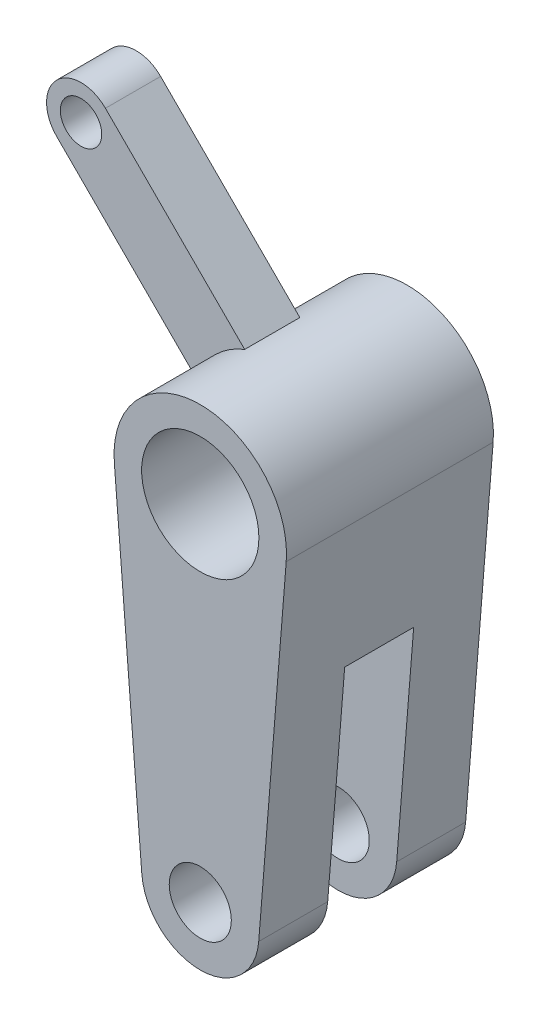
ISO-10303-21;
HEADER;
FILE_DESCRIPTION(('STEP AP214'),'2;1');
FILE_NAME('part.step','',(''),(''),'','','');
FILE_SCHEMA(('AUTOMOTIVE_DESIGN { 1 0 10303 214 1 1 1 1 }'));
ENDSEC;
DATA;
#1=APPLICATION_CONTEXT('core data for automotive mechanical design processes');
#2=APPLICATION_PROTOCOL_DEFINITION('international standard','automotive_design',2000,#1);
#3=PRODUCT_CONTEXT('',#1,'mechanical');
#4=PRODUCT('Part','Part','',(#3));
#5=PRODUCT_RELATED_PRODUCT_CATEGORY('part','',(#4));
#6=PRODUCT_DEFINITION_FORMATION('','',#4);
#7=PRODUCT_DEFINITION_CONTEXT('part definition',#1,'design');
#8=PRODUCT_DEFINITION('design','',#6,#7);
#9=PRODUCT_DEFINITION_SHAPE('','',#8);
#10=(LENGTH_UNIT() NAMED_UNIT(*) SI_UNIT(.MILLI.,.METRE.));
#11=(NAMED_UNIT(*) PLANE_ANGLE_UNIT() SI_UNIT($,.RADIAN.));
#12=(NAMED_UNIT(*) SI_UNIT($,.STERADIAN.) SOLID_ANGLE_UNIT());
#13=UNCERTAINTY_MEASURE_WITH_UNIT(LENGTH_MEASURE(1.E-05),#10,'distance_accuracy_value','');
#14=(GEOMETRIC_REPRESENTATION_CONTEXT(3) GLOBAL_UNCERTAINTY_ASSIGNED_CONTEXT((#13)) GLOBAL_UNIT_ASSIGNED_CONTEXT((#10,
#11,#12)) REPRESENTATION_CONTEXT('',''));
#15=CARTESIAN_POINT('',(0.,0.,0.));
#16=DIRECTION('',(0.,0.,1.));
#17=DIRECTION('',(1.,0.,0.));
#18=AXIS2_PLACEMENT_3D('',#15,#16,#17);
#19=CARTESIAN_POINT('',(0.,-50.,15.));
#20=DIRECTION('',(0.,0.,-1.));
#21=DIRECTION('',(-1.,0.,0.));
#22=AXIS2_PLACEMENT_3D('',#19,#20,#21);
#23=CYLINDRICAL_SURFACE('',#22,4.5);
#24=CARTESIAN_POINT('',(0.,-50.,15.));
#25=DIRECTION('',(0.,0.,1.));
#26=DIRECTION('',(1.,0.,0.));
#27=AXIS2_PLACEMENT_3D('',#24,#25,#26);
#28=CIRCLE('',#27,4.5);
#29=CARTESIAN_POINT('',(4.50000000000001,-50.,15.));
#30=VERTEX_POINT('',#29);
#31=EDGE_CURVE('E204',#30,#30,#28,.T.);
#32=ORIENTED_EDGE('',*,*,#31,.T.);
#33=EDGE_LOOP('',(#32));
#34=FACE_BOUND('',#33,.T.);
#35=CARTESIAN_POINT('',(0.,-50.,5.));
#36=DIRECTION('',(0.,0.,-1.));
#37=DIRECTION('',(-1.,0.,0.));
#38=AXIS2_PLACEMENT_3D('',#35,#36,#37);
#39=CIRCLE('',#38,4.5);
#40=CARTESIAN_POINT('',(-4.5,-50.,5.));
#41=VERTEX_POINT('',#40);
#42=EDGE_CURVE('E180',#41,#41,#39,.T.);
#43=ORIENTED_EDGE('',*,*,#42,.T.);
#44=EDGE_LOOP('',(#43));
#45=FACE_BOUND('',#44,.T.);
#46=ADVANCED_FACE('F37',(#34,#45),#23,.F.);
#47=CARTESIAN_POINT('',(0.,-50.,15.));
#48=DIRECTION('',(0.,0.,-1.));
#49=DIRECTION('',(-1.,0.,0.));
#50=AXIS2_PLACEMENT_3D('',#47,#48,#49);
#51=CYLINDRICAL_SURFACE('',#50,8.5);
#52=CARTESIAN_POINT('',(0.,-50.,5.));
#53=DIRECTION('',(0.,0.,-1.));
#54=DIRECTION('',(-1.,0.,0.));
#55=AXIS2_PLACEMENT_3D('',#52,#53,#54);
#56=CIRCLE('',#55,8.5);
#57=CARTESIAN_POINT('',(8.47275634017644,-50.68,5.));
#58=VERTEX_POINT('',#57);
#59=CARTESIAN_POINT('',(-8.47275634017643,-50.68,5.));
#60=VERTEX_POINT('',#59);
#61=EDGE_CURVE('E238',#58,#60,#56,.T.);
#62=ORIENTED_EDGE('',*,*,#61,.F.);
#63=DIRECTION('',(0.,0.,-1.));
#64=VECTOR('',#63,1.);
#65=CARTESIAN_POINT('',(8.47275634017644,-50.68,15.));
#66=LINE('',#65,#64);
#67=CARTESIAN_POINT('',(8.47275634017644,-50.68,15.));
#68=VERTEX_POINT('',#67);
#69=EDGE_CURVE('E226',#68,#58,#66,.T.);
#70=ORIENTED_EDGE('',*,*,#69,.F.);
#71=CARTESIAN_POINT('',(0.,-50.,15.));
#72=DIRECTION('',(0.,0.,1.));
#73=DIRECTION('',(1.,0.,0.));
#74=AXIS2_PLACEMENT_3D('',#71,#72,#73);
#75=CIRCLE('',#74,8.5);
#76=CARTESIAN_POINT('',(-8.47275634017643,-50.68,15.));
#77=VERTEX_POINT('',#76);
#78=EDGE_CURVE('E202',#77,#68,#75,.T.);
#79=ORIENTED_EDGE('',*,*,#78,.F.);
#80=DIRECTION('',(0.,0.,-1.));
#81=VECTOR('',#80,1.);
#82=CARTESIAN_POINT('',(-8.47275634017643,-50.68,15.));
#83=LINE('',#82,#81);
#84=EDGE_CURVE('E230',#77,#60,#83,.T.);
#85=ORIENTED_EDGE('',*,*,#84,.T.);
#86=EDGE_LOOP('',(#62,#70,#79,#85));
#87=FACE_BOUND('',#86,.T.);
#88=ADVANCED_FACE('F271',(#87),#51,.T.);
#89=CARTESIAN_POINT('',(12.4599357943771,-0.999999999999998,15.));
#90=DIRECTION('',(0.996794863550169,-0.0799999999999999,0.));
#91=DIRECTION('',(0.0799999999999999,0.996794863550169,0.));
#92=AXIS2_PLACEMENT_3D('',#89,#90,#91);
#93=PLANE('',#92);
#94=DIRECTION('',(0.0799999999999999,0.996794863550169,0.));
#95=VECTOR('',#94,1.);
#96=CARTESIAN_POINT('',(12.4599357943771,-0.999999999999998,-5.));
#97=LINE('',#96,#95);
#98=CARTESIAN_POINT('',(8.47275634017644,-50.68,-5.));
#99=VERTEX_POINT('',#98);
#100=CARTESIAN_POINT('',(10.9350483219574,-20.,-5.));
#101=VERTEX_POINT('',#100);
#102=EDGE_CURVE('E186',#99,#101,#97,.T.);
#103=ORIENTED_EDGE('',*,*,#102,.F.);
#104=CARTESIAN_POINT('',(8.47275634017644,-50.68,-15.));
#105=VERTEX_POINT('',#104);
#106=EDGE_CURVE('E210',#99,#105,#66,.T.);
#107=ORIENTED_EDGE('',*,*,#106,.T.);
#108=DIRECTION('',(-0.0799999999999999,-0.996794863550169,0.));
#109=VECTOR('',#108,1.);
#110=CARTESIAN_POINT('',(12.4599357943771,-0.999999999999998,-15.));
#111=LINE('',#110,#109);
#112=CARTESIAN_POINT('',(12.4599357943771,-1.,-15.));
#113=VERTEX_POINT('',#112);
#114=EDGE_CURVE('E193',#113,#105,#111,.T.);
#115=ORIENTED_EDGE('',*,*,#114,.F.);
#116=DIRECTION('',(0.,0.,-1.));
#117=VECTOR('',#116,1.);
#118=CARTESIAN_POINT('',(12.4599357943771,-1.,15.));
#119=LINE('',#118,#117);
#120=CARTESIAN_POINT('',(12.4599357943771,-1.,15.));
#121=VERTEX_POINT('',#120);
#122=EDGE_CURVE('E236',#121,#113,#119,.T.);
#123=ORIENTED_EDGE('',*,*,#122,.F.);
#124=DIRECTION('',(-0.0799999999999999,-0.996794863550169,0.));
#125=VECTOR('',#124,1.);
#126=CARTESIAN_POINT('',(12.4599357943771,-0.999999999999998,15.));
#127=LINE('',#126,#125);
#128=EDGE_CURVE('E194',#121,#68,#127,.T.);
#129=ORIENTED_EDGE('',*,*,#128,.T.);
#130=ORIENTED_EDGE('',*,*,#69,.T.);
#131=DIRECTION('',(0.0799999999999999,0.996794863550169,0.));
#132=VECTOR('',#131,1.);
#133=CARTESIAN_POINT('',(12.4599357943771,-0.999999999999998,5.));
#134=LINE('',#133,#132);
#135=CARTESIAN_POINT('',(10.9350483219574,-20.,5.));
#136=VERTEX_POINT('',#135);
#137=EDGE_CURVE('E177',#58,#136,#134,.T.);
#138=ORIENTED_EDGE('',*,*,#137,.T.);
#139=DIRECTION('',(0.,0.,1.));
#140=VECTOR('',#139,1.);
#141=CARTESIAN_POINT('',(10.9350483219574,-20.,15.));
#142=LINE('',#141,#140);
#143=EDGE_CURVE('E191',#101,#136,#142,.T.);
#144=ORIENTED_EDGE('',*,*,#143,.F.);
#145=EDGE_LOOP('',(#103,#107,#115,#123,#129,#130,#138,#144));
#146=FACE_BOUND('',#145,.T.);
#147=ADVANCED_FACE('F39',(#146),#93,.T.);
#148=CARTESIAN_POINT('',(0.,0.,15.));
#149=DIRECTION('',(0.,0.,-1.));
#150=DIRECTION('',(-1.,0.,0.));
#151=AXIS2_PLACEMENT_3D('',#148,#149,#150);
#152=CYLINDRICAL_SURFACE('',#151,12.5);
#153=DIRECTION('',(0.,0.,-1.));
#154=VECTOR('',#153,1.);
#155=CARTESIAN_POINT('',(-4.56539196707712,11.6364597789426,4.));
#156=LINE('',#155,#154);
#157=CARTESIAN_POINT('',(-4.56539196707712,11.6364597789426,4.));
#158=VERTEX_POINT('',#157);
#159=CARTESIAN_POINT('',(-4.56539196707712,11.6364597789426,-4.));
#160=VERTEX_POINT('',#159);
#161=EDGE_CURVE('E52',#158,#160,#156,.T.);
#162=ORIENTED_EDGE('',*,*,#161,.F.);
#163=CARTESIAN_POINT('',(0.,0.,4.));
#164=DIRECTION('',(0.,0.,1.));
#165=DIRECTION('',(1.,0.,0.));
#166=AXIS2_PLACEMENT_3D('',#163,#164,#165);
#167=CIRCLE('',#166,12.5);
#168=CARTESIAN_POINT('',(-11.6364597789426,4.56539196707706,4.));
#169=VERTEX_POINT('',#168);
#170=EDGE_CURVE('E57',#158,#169,#167,.T.);
#171=ORIENTED_EDGE('',*,*,#170,.T.);
#172=DIRECTION('',(0.,0.,-1.));
#173=VECTOR('',#172,1.);
#174=CARTESIAN_POINT('',(-11.6364597789426,4.56539196707707,4.));
#175=LINE('',#174,#173);
#176=CARTESIAN_POINT('',(-11.6364597789426,4.56539196707707,-4.));
#177=VERTEX_POINT('',#176);
#178=EDGE_CURVE('E153',#169,#177,#175,.T.);
#179=ORIENTED_EDGE('',*,*,#178,.T.);
#180=CARTESIAN_POINT('',(0.,0.,-4.));
#181=DIRECTION('',(0.,0.,1.));
#182=DIRECTION('',(1.,0.,0.));
#183=AXIS2_PLACEMENT_3D('',#180,#181,#182);
#184=CIRCLE('',#183,12.5);
#185=EDGE_CURVE('E154',#160,#177,#184,.T.);
#186=ORIENTED_EDGE('',*,*,#185,.F.);
#187=EDGE_LOOP('',(#162,#171,#179,#186));
#188=FACE_BOUND('',#187,.T.);
#189=CARTESIAN_POINT('',(0.,0.,-15.));
#190=DIRECTION('',(0.,0.,1.));
#191=DIRECTION('',(1.,0.,0.));
#192=AXIS2_PLACEMENT_3D('',#189,#190,#191);
#193=CIRCLE('',#192,12.5);
#194=CARTESIAN_POINT('',(-12.4599357943771,-1.,-15.));
#195=VERTEX_POINT('',#194);
#196=EDGE_CURVE('E213',#113,#195,#193,.T.);
#197=ORIENTED_EDGE('',*,*,#196,.T.);
#198=DIRECTION('',(0.,0.,-1.));
#199=VECTOR('',#198,1.);
#200=CARTESIAN_POINT('',(-12.4599357943771,-1.,15.));
#201=LINE('',#200,#199);
#202=CARTESIAN_POINT('',(-12.4599357943771,-1.,15.));
#203=VERTEX_POINT('',#202);
#204=EDGE_CURVE('E233',#203,#195,#201,.T.);
#205=ORIENTED_EDGE('',*,*,#204,.F.);
#206=CARTESIAN_POINT('',(0.,0.,15.));
#207=DIRECTION('',(0.,0.,1.));
#208=DIRECTION('',(1.,0.,0.));
#209=AXIS2_PLACEMENT_3D('',#206,#207,#208);
#210=CIRCLE('',#209,12.5);
#211=EDGE_CURVE('E197',#121,#203,#210,.T.);
#212=ORIENTED_EDGE('',*,*,#211,.F.);
#213=ORIENTED_EDGE('',*,*,#122,.T.);
#214=EDGE_LOOP('',(#197,#205,#212,#213));
#215=FACE_BOUND('',#214,.T.);
#216=ADVANCED_FACE('F278',(#188,#215),#152,.T.);
#217=CARTESIAN_POINT('',(-12.4599357943771,-1.,15.));
#218=DIRECTION('',(0.996794863550169,0.0800000000000001,0.));
#219=DIRECTION('',(-0.0800000000000001,0.996794863550169,0.));
#220=AXIS2_PLACEMENT_3D('',#217,#218,#219);
#221=PLANE('',#220);
#222=CARTESIAN_POINT('',(-8.47275634017643,-50.68,-5.));
#223=VERTEX_POINT('',#222);
#224=CARTESIAN_POINT('',(-8.47275634017643,-50.68,-15.));
#225=VERTEX_POINT('',#224);
#226=EDGE_CURVE('E229',#223,#225,#83,.T.);
#227=ORIENTED_EDGE('',*,*,#226,.F.);
#228=DIRECTION('',(-0.0800000000000001,0.996794863550169,0.));
#229=VECTOR('',#228,1.);
#230=CARTESIAN_POINT('',(-12.4599357943771,-1.,-5.));
#231=LINE('',#230,#229);
#232=CARTESIAN_POINT('',(-10.9350483219574,-20.,-5.));
#233=VERTEX_POINT('',#232);
#234=EDGE_CURVE('E183',#223,#233,#231,.T.);
#235=ORIENTED_EDGE('',*,*,#234,.T.);
#236=DIRECTION('',(0.,0.,1.));
#237=VECTOR('',#236,1.);
#238=CARTESIAN_POINT('',(-10.9350483219574,-20.,15.));
#239=LINE('',#238,#237);
#240=CARTESIAN_POINT('',(-10.9350483219574,-20.,5.));
#241=VERTEX_POINT('',#240);
#242=EDGE_CURVE('E11',#233,#241,#239,.T.);
#243=ORIENTED_EDGE('',*,*,#242,.T.);
#244=DIRECTION('',(-0.0800000000000001,0.996794863550169,0.));
#245=VECTOR('',#244,1.);
#246=CARTESIAN_POINT('',(-12.4599357943771,-1.,5.));
#247=LINE('',#246,#245);
#248=EDGE_CURVE('E173',#60,#241,#247,.T.);
#249=ORIENTED_EDGE('',*,*,#248,.F.);
#250=ORIENTED_EDGE('',*,*,#84,.F.);
#251=DIRECTION('',(0.0800000000000001,-0.996794863550169,0.));
#252=VECTOR('',#251,1.);
#253=CARTESIAN_POINT('',(-12.4599357943771,-1.,15.));
#254=LINE('',#253,#252);
#255=EDGE_CURVE('E200',#203,#77,#254,.T.);
#256=ORIENTED_EDGE('',*,*,#255,.F.);
#257=ORIENTED_EDGE('',*,*,#204,.T.);
#258=DIRECTION('',(0.0800000000000001,-0.996794863550169,0.));
#259=VECTOR('',#258,1.);
#260=CARTESIAN_POINT('',(-12.4599357943771,-1.,-15.));
#261=LINE('',#260,#259);
#262=EDGE_CURVE('E215',#195,#225,#261,.T.);
#263=ORIENTED_EDGE('',*,*,#262,.T.);
#264=EDGE_LOOP('',(#227,#235,#243,#249,#250,#256,#257,#263));
#265=FACE_BOUND('',#264,.T.);
#266=ADVANCED_FACE('F247',(#265),#221,.F.);
#267=CARTESIAN_POINT('',(0.,-50.,-5.));
#268=DIRECTION('',(0.,0.,-1.));
#269=DIRECTION('',(-1.,0.,0.));
#270=AXIS2_PLACEMENT_3D('',#267,#268,#269);
#271=CIRCLE('',#270,4.5);
#272=CARTESIAN_POINT('',(-4.5,-50.,-5.));
#273=VERTEX_POINT('',#272);
#274=EDGE_CURVE('E188',#273,#273,#271,.T.);
#275=ORIENTED_EDGE('',*,*,#274,.F.);
#276=EDGE_LOOP('',(#275));
#277=FACE_BOUND('',#276,.T.);
#278=CARTESIAN_POINT('',(0.,-50.,-15.));
#279=DIRECTION('',(0.,0.,1.));
#280=DIRECTION('',(1.,0.,0.));
#281=AXIS2_PLACEMENT_3D('',#278,#279,#280);
#282=CIRCLE('',#281,4.5);
#283=CARTESIAN_POINT('',(4.50000000000001,-50.,-15.));
#284=VERTEX_POINT('',#283);
#285=EDGE_CURVE('E221',#284,#284,#282,.T.);
#286=ORIENTED_EDGE('',*,*,#285,.F.);
#287=EDGE_LOOP('',(#286));
#288=FACE_BOUND('',#287,.T.);
#289=ADVANCED_FACE('F284',(#277,#288),#23,.F.);
#290=ORIENTED_EDGE('',*,*,#106,.F.);
#291=CARTESIAN_POINT('',(0.,-50.,-5.));
#292=DIRECTION('',(0.,0.,-1.));
#293=DIRECTION('',(-1.,0.,0.));
#294=AXIS2_PLACEMENT_3D('',#291,#292,#293);
#295=CIRCLE('',#294,8.5);
#296=EDGE_CURVE('E45',#99,#223,#295,.T.);
#297=ORIENTED_EDGE('',*,*,#296,.T.);
#298=ORIENTED_EDGE('',*,*,#226,.T.);
#299=CARTESIAN_POINT('',(0.,-50.,-15.));
#300=DIRECTION('',(0.,0.,1.));
#301=DIRECTION('',(1.,0.,0.));
#302=AXIS2_PLACEMENT_3D('',#299,#300,#301);
#303=CIRCLE('',#302,8.5);
#304=EDGE_CURVE('E218',#225,#105,#303,.T.);
#305=ORIENTED_EDGE('',*,*,#304,.T.);
#306=EDGE_LOOP('',(#290,#297,#298,#305));
#307=FACE_BOUND('',#306,.T.);
#308=ADVANCED_FACE('F243',(#307),#51,.T.);
#309=CARTESIAN_POINT('',(0.,0.,15.));
#310=DIRECTION('',(0.,0.,-1.));
#311=DIRECTION('',(-1.,0.,0.));
#312=AXIS2_PLACEMENT_3D('',#309,#310,#311);
#313=CYLINDRICAL_SURFACE('',#312,8.5);
#314=CARTESIAN_POINT('',(0.,0.,15.));
#315=DIRECTION('',(0.,0.,1.));
#316=DIRECTION('',(1.,0.,0.));
#317=AXIS2_PLACEMENT_3D('',#314,#315,#316);
#318=CIRCLE('',#317,8.5);
#319=CARTESIAN_POINT('',(8.5,0.,15.));
#320=VERTEX_POINT('',#319);
#321=EDGE_CURVE('E207',#320,#320,#318,.T.);
#322=ORIENTED_EDGE('',*,*,#321,.T.);
#323=EDGE_LOOP('',(#322));
#324=FACE_BOUND('',#323,.T.);
#325=CARTESIAN_POINT('',(0.,0.,-15.));
#326=DIRECTION('',(0.,0.,1.));
#327=DIRECTION('',(1.,0.,0.));
#328=AXIS2_PLACEMENT_3D('',#325,#326,#327);
#329=CIRCLE('',#328,8.5);
#330=CARTESIAN_POINT('',(8.5,0.,-15.));
#331=VERTEX_POINT('',#330);
#332=EDGE_CURVE('E198',#331,#331,#329,.T.);
#333=ORIENTED_EDGE('',*,*,#332,.F.);
#334=EDGE_LOOP('',(#333));
#335=FACE_BOUND('',#334,.T.);
#336=ADVANCED_FACE('F300',(#324,#335),#313,.F.);
#337=CARTESIAN_POINT('',(0.,0.,15.));
#338=DIRECTION('',(0.,0.,1.));
#339=DIRECTION('',(1.,0.,0.));
#340=AXIS2_PLACEMENT_3D('',#337,#338,#339);
#341=PLANE('',#340);
#342=ORIENTED_EDGE('',*,*,#128,.F.);
#343=ORIENTED_EDGE('',*,*,#211,.T.);
#344=ORIENTED_EDGE('',*,*,#255,.T.);
#345=ORIENTED_EDGE('',*,*,#78,.T.);
#346=EDGE_LOOP('',(#342,#343,#344,#345));
#347=FACE_BOUND('',#346,.T.);
#348=ORIENTED_EDGE('',*,*,#31,.F.);
#349=EDGE_LOOP('',(#348));
#350=FACE_BOUND('',#349,.T.);
#351=ORIENTED_EDGE('',*,*,#321,.F.);
#352=EDGE_LOOP('',(#351));
#353=FACE_BOUND('',#352,.T.);
#354=ADVANCED_FACE('F275',(#347,#350,#353),#341,.T.);
#355=CARTESIAN_POINT('',(0.,0.,-15.));
#356=DIRECTION('',(0.,0.,1.));
#357=DIRECTION('',(1.,0.,0.));
#358=AXIS2_PLACEMENT_3D('',#355,#356,#357);
#359=PLANE('',#358);
#360=ORIENTED_EDGE('',*,*,#114,.T.);
#361=ORIENTED_EDGE('',*,*,#304,.F.);
#362=ORIENTED_EDGE('',*,*,#262,.F.);
#363=ORIENTED_EDGE('',*,*,#196,.F.);
#364=EDGE_LOOP('',(#360,#361,#362,#363));
#365=FACE_BOUND('',#364,.T.);
#366=ORIENTED_EDGE('',*,*,#285,.T.);
#367=EDGE_LOOP('',(#366));
#368=FACE_BOUND('',#367,.T.);
#369=ORIENTED_EDGE('',*,*,#332,.T.);
#370=EDGE_LOOP('',(#369));
#371=FACE_BOUND('',#370,.T.);
#372=ADVANCED_FACE('F254',(#365,#368,#371),#359,.F.);
#373=CARTESIAN_POINT('',(-15.,-20.,-5.));
#374=DIRECTION('',(0.,1.,0.));
#375=DIRECTION('',(0.,0.,1.));
#376=AXIS2_PLACEMENT_3D('',#373,#374,#375);
#377=PLANE('',#376);
#378=ORIENTED_EDGE('',*,*,#143,.T.);
#379=DIRECTION('',(-1.,0.,0.));
#380=VECTOR('',#379,1.);
#381=CARTESIAN_POINT('',(-15.,-20.,5.));
#382=LINE('',#381,#380);
#383=EDGE_CURVE('E169',#136,#241,#382,.T.);
#384=ORIENTED_EDGE('',*,*,#383,.T.);
#385=ORIENTED_EDGE('',*,*,#242,.F.);
#386=DIRECTION('',(-1.,0.,0.));
#387=VECTOR('',#386,1.);
#388=CARTESIAN_POINT('',(-15.,-20.,-5.));
#389=LINE('',#388,#387);
#390=EDGE_CURVE('E170',#101,#233,#389,.T.);
#391=ORIENTED_EDGE('',*,*,#390,.F.);
#392=EDGE_LOOP('',(#378,#384,#385,#391));
#393=FACE_BOUND('',#392,.T.);
#394=ADVANCED_FACE('F263',(#393),#377,.F.);
#395=CARTESIAN_POINT('',(0.,0.,-5.));
#396=DIRECTION('',(0.,0.,-1.));
#397=DIRECTION('',(-1.,0.,0.));
#398=AXIS2_PLACEMENT_3D('',#395,#396,#397);
#399=PLANE('',#398);
#400=ORIENTED_EDGE('',*,*,#274,.T.);
#401=EDGE_LOOP('',(#400));
#402=FACE_BOUND('',#401,.T.);
#403=ORIENTED_EDGE('',*,*,#102,.T.);
#404=ORIENTED_EDGE('',*,*,#390,.T.);
#405=ORIENTED_EDGE('',*,*,#234,.F.);
#406=ORIENTED_EDGE('',*,*,#296,.F.);
#407=EDGE_LOOP('',(#403,#404,#405,#406));
#408=FACE_BOUND('',#407,.T.);
#409=ADVANCED_FACE('F261',(#402,#408),#399,.F.);
#410=CARTESIAN_POINT('',(0.,0.,5.));
#411=DIRECTION('',(0.,0.,-1.));
#412=DIRECTION('',(-1.,0.,0.));
#413=AXIS2_PLACEMENT_3D('',#410,#411,#412);
#414=PLANE('',#413);
#415=ORIENTED_EDGE('',*,*,#42,.F.);
#416=EDGE_LOOP('',(#415));
#417=FACE_BOUND('',#416,.T.);
#418=ORIENTED_EDGE('',*,*,#61,.T.);
#419=ORIENTED_EDGE('',*,*,#248,.T.);
#420=ORIENTED_EDGE('',*,*,#383,.F.);
#421=ORIENTED_EDGE('',*,*,#137,.F.);
#422=EDGE_LOOP('',(#418,#419,#420,#421));
#423=FACE_BOUND('',#422,.T.);
#424=ADVANCED_FACE('F318',(#417,#423),#414,.T.);
#425=CARTESIAN_POINT('',(3.53553390593273,3.53553390593274,4.));
#426=DIRECTION('',(-0.707106781186546,-0.707106781186549,0.));
#427=DIRECTION('',(0.707106781186549,-0.707106781186546,0.));
#428=AXIS2_PLACEMENT_3D('',#425,#426,#427);
#429=PLANE('',#428);
#430=DIRECTION('',(-0.707106781186549,0.707106781186546,0.));
#431=VECTOR('',#430,1.);
#432=CARTESIAN_POINT('',(3.53553390593273,3.53553390593274,-4.));
#433=LINE('',#432,#431);
#434=CARTESIAN_POINT('',(-24.7487373415292,31.8198051533946,-4.));
#435=VERTEX_POINT('',#434);
#436=EDGE_CURVE('E137',#160,#435,#433,.T.);
#437=ORIENTED_EDGE('',*,*,#436,.T.);
#438=DIRECTION('',(0.,0.,-1.));
#439=VECTOR('',#438,1.);
#440=CARTESIAN_POINT('',(-24.7487373415292,31.8198051533946,4.));
#441=LINE('',#440,#439);
#442=CARTESIAN_POINT('',(-24.7487373415292,31.8198051533946,4.));
#443=VERTEX_POINT('',#442);
#444=EDGE_CURVE('E134',#443,#435,#441,.T.);
#445=ORIENTED_EDGE('',*,*,#444,.F.);
#446=DIRECTION('',(-0.707106781186549,0.707106781186546,0.));
#447=VECTOR('',#446,1.);
#448=CARTESIAN_POINT('',(3.53553390593273,3.53553390593274,4.));
#449=LINE('',#448,#447);
#450=EDGE_CURVE('E123',#158,#443,#449,.T.);
#451=ORIENTED_EDGE('',*,*,#450,.F.);
#452=ORIENTED_EDGE('',*,*,#161,.T.);
#453=EDGE_LOOP('',(#437,#445,#451,#452));
#454=FACE_BOUND('',#453,.T.);
#455=ADVANCED_FACE('F135',(#454),#429,.F.);
#456=CARTESIAN_POINT('',(-28.284271247462,28.2842712474618,4.));
#457=DIRECTION('',(0.,0.,-1.));
#458=DIRECTION('',(-1.,0.,0.));
#459=AXIS2_PLACEMENT_3D('',#456,#457,#458);
#460=CYLINDRICAL_SURFACE('',#459,5.);
#461=CARTESIAN_POINT('',(-28.284271247462,28.2842712474618,-4.));
#462=DIRECTION('',(0.,0.,1.));
#463=DIRECTION('',(1.,0.,0.));
#464=AXIS2_PLACEMENT_3D('',#461,#462,#463);
#465=CIRCLE('',#464,5.);
#466=CARTESIAN_POINT('',(-31.8198051533947,24.7487373415291,-4.));
#467=VERTEX_POINT('',#466);
#468=EDGE_CURVE('E158',#435,#467,#465,.T.);
#469=ORIENTED_EDGE('',*,*,#468,.T.);
#470=DIRECTION('',(0.,0.,-1.));
#471=VECTOR('',#470,1.);
#472=CARTESIAN_POINT('',(-31.8198051533947,24.7487373415291,4.));
#473=LINE('',#472,#471);
#474=CARTESIAN_POINT('',(-31.8198051533947,24.7487373415291,4.));
#475=VERTEX_POINT('',#474);
#476=EDGE_CURVE('E141',#475,#467,#473,.T.);
#477=ORIENTED_EDGE('',*,*,#476,.F.);
#478=CARTESIAN_POINT('',(-28.284271247462,28.2842712474618,4.));
#479=DIRECTION('',(0.,0.,1.));
#480=DIRECTION('',(1.,0.,0.));
#481=AXIS2_PLACEMENT_3D('',#478,#479,#480);
#482=CIRCLE('',#481,5.);
#483=EDGE_CURVE('E129',#443,#475,#482,.T.);
#484=ORIENTED_EDGE('',*,*,#483,.F.);
#485=ORIENTED_EDGE('',*,*,#444,.T.);
#486=EDGE_LOOP('',(#469,#477,#484,#485));
#487=FACE_BOUND('',#486,.T.);
#488=ADVANCED_FACE('F143',(#487),#460,.T.);
#489=CARTESIAN_POINT('',(-3.53553390593273,-3.53553390593274,4.));
#490=DIRECTION('',(-0.707106781186546,-0.707106781186549,0.));
#491=DIRECTION('',(0.707106781186549,-0.707106781186546,0.));
#492=AXIS2_PLACEMENT_3D('',#489,#490,#491);
#493=PLANE('',#492);
#494=DIRECTION('',(-0.707106781186549,0.707106781186546,0.));
#495=VECTOR('',#494,1.);
#496=CARTESIAN_POINT('',(-3.53553390593273,-3.53553390593274,-4.));
#497=LINE('',#496,#495);
#498=EDGE_CURVE('E160',#177,#467,#497,.T.);
#499=ORIENTED_EDGE('',*,*,#498,.F.);
#500=ORIENTED_EDGE('',*,*,#178,.F.);
#501=DIRECTION('',(-0.707106781186549,0.707106781186546,0.));
#502=VECTOR('',#501,1.);
#503=CARTESIAN_POINT('',(-3.53553390593273,-3.53553390593274,4.));
#504=LINE('',#503,#502);
#505=EDGE_CURVE('E145',#169,#475,#504,.T.);
#506=ORIENTED_EDGE('',*,*,#505,.T.);
#507=ORIENTED_EDGE('',*,*,#476,.T.);
#508=EDGE_LOOP('',(#499,#500,#506,#507));
#509=FACE_BOUND('',#508,.T.);
#510=ADVANCED_FACE('F329',(#509),#493,.T.);
#511=CARTESIAN_POINT('',(-28.284271247462,28.2842712474618,4.));
#512=DIRECTION('',(0.,0.,-1.));
#513=DIRECTION('',(-1.,0.,0.));
#514=AXIS2_PLACEMENT_3D('',#511,#512,#513);
#515=CYLINDRICAL_SURFACE('',#514,3.);
#516=CARTESIAN_POINT('',(-28.284271247462,28.2842712474618,4.));
#517=DIRECTION('',(0.,0.,1.));
#518=DIRECTION('',(1.,0.,0.));
#519=AXIS2_PLACEMENT_3D('',#516,#517,#518);
#520=CIRCLE('',#519,3.);
#521=CARTESIAN_POINT('',(-25.284271247462,28.2842712474618,4.));
#522=VERTEX_POINT('',#521);
#523=EDGE_CURVE('E147',#522,#522,#520,.T.);
#524=ORIENTED_EDGE('',*,*,#523,.T.);
#525=EDGE_LOOP('',(#524));
#526=FACE_BOUND('',#525,.T.);
#527=CARTESIAN_POINT('',(-28.284271247462,28.2842712474618,-4.));
#528=DIRECTION('',(0.,0.,1.));
#529=DIRECTION('',(1.,0.,0.));
#530=AXIS2_PLACEMENT_3D('',#527,#528,#529);
#531=CIRCLE('',#530,3.);
#532=CARTESIAN_POINT('',(-25.284271247462,28.2842712474618,-4.));
#533=VERTEX_POINT('',#532);
#534=EDGE_CURVE('E163',#533,#533,#531,.T.);
#535=ORIENTED_EDGE('',*,*,#534,.F.);
#536=EDGE_LOOP('',(#535));
#537=FACE_BOUND('',#536,.T.);
#538=ADVANCED_FACE('F332',(#526,#537),#515,.F.);
#539=CARTESIAN_POINT('',(0.,0.,4.));
#540=DIRECTION('',(0.,0.,1.));
#541=DIRECTION('',(1.,0.,0.));
#542=AXIS2_PLACEMENT_3D('',#539,#540,#541);
#543=PLANE('',#542);
#544=ORIENTED_EDGE('',*,*,#170,.F.);
#545=ORIENTED_EDGE('',*,*,#450,.T.);
#546=ORIENTED_EDGE('',*,*,#483,.T.);
#547=ORIENTED_EDGE('',*,*,#505,.F.);
#548=EDGE_LOOP('',(#544,#545,#546,#547));
#549=FACE_BOUND('',#548,.T.);
#550=ORIENTED_EDGE('',*,*,#523,.F.);
#551=EDGE_LOOP('',(#550));
#552=FACE_BOUND('',#551,.T.);
#553=ADVANCED_FACE('F125',(#549,#552),#543,.T.);
#554=CARTESIAN_POINT('',(0.,0.,-4.));
#555=DIRECTION('',(0.,0.,1.));
#556=DIRECTION('',(1.,0.,0.));
#557=AXIS2_PLACEMENT_3D('',#554,#555,#556);
#558=PLANE('',#557);
#559=ORIENTED_EDGE('',*,*,#185,.T.);
#560=ORIENTED_EDGE('',*,*,#498,.T.);
#561=ORIENTED_EDGE('',*,*,#468,.F.);
#562=ORIENTED_EDGE('',*,*,#436,.F.);
#563=EDGE_LOOP('',(#559,#560,#561,#562));
#564=FACE_BOUND('',#563,.T.);
#565=ORIENTED_EDGE('',*,*,#534,.T.);
#566=EDGE_LOOP('',(#565));
#567=FACE_BOUND('',#566,.T.);
#568=ADVANCED_FACE('F337',(#564,#567),#558,.F.);
#569=CLOSED_SHELL('',(#46,#88,#147,#216,#266,#289,#308,#336,#354,#372,#394,#409,#424,#455,#488,
#510,#538,#553,#568));
#570=MANIFOLD_SOLID_BREP('B2',#569);
#571=ADVANCED_BREP_SHAPE_REPRESENTATION('',(#18,#570),#14);
#572=SHAPE_DEFINITION_REPRESENTATION(#9,#571);
ENDSEC;
END-ISO-10303-21;
